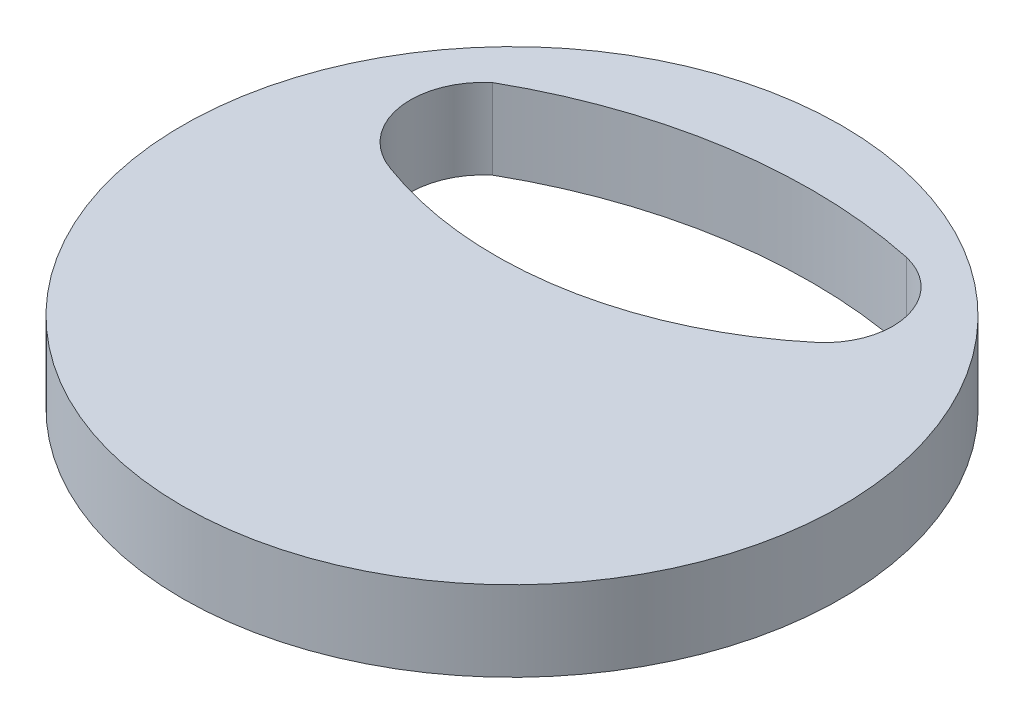
ISO-10303-21;
HEADER;
FILE_DESCRIPTION(('STEP AP214'),'2;1');
FILE_NAME('part.step','',(''),(''),'','','');
FILE_SCHEMA(('AUTOMOTIVE_DESIGN { 1 0 10303 214 1 1 1 1 }'));
ENDSEC;
DATA;
#1=APPLICATION_CONTEXT('core data for automotive mechanical design processes');
#2=APPLICATION_PROTOCOL_DEFINITION('international standard','automotive_design',2000,#1);
#3=PRODUCT_CONTEXT('',#1,'mechanical');
#4=PRODUCT('Part','Part','',(#3));
#5=PRODUCT_RELATED_PRODUCT_CATEGORY('part','',(#4));
#6=PRODUCT_DEFINITION_FORMATION('','',#4);
#7=PRODUCT_DEFINITION_CONTEXT('part definition',#1,'design');
#8=PRODUCT_DEFINITION('design','',#6,#7);
#9=PRODUCT_DEFINITION_SHAPE('','',#8);
#10=(LENGTH_UNIT() NAMED_UNIT(*) SI_UNIT(.MILLI.,.METRE.));
#11=(NAMED_UNIT(*) PLANE_ANGLE_UNIT() SI_UNIT($,.RADIAN.));
#12=(NAMED_UNIT(*) SI_UNIT($,.STERADIAN.) SOLID_ANGLE_UNIT());
#13=UNCERTAINTY_MEASURE_WITH_UNIT(LENGTH_MEASURE(1.E-05),#10,'distance_accuracy_value','');
#14=(GEOMETRIC_REPRESENTATION_CONTEXT(3) GLOBAL_UNCERTAINTY_ASSIGNED_CONTEXT((#13)) GLOBAL_UNIT_ASSIGNED_CONTEXT((#10,
#11,#12)) REPRESENTATION_CONTEXT('',''));
#15=CARTESIAN_POINT('',(0.,0.,0.));
#16=DIRECTION('',(0.,0.,1.));
#17=DIRECTION('',(1.,0.,0.));
#18=AXIS2_PLACEMENT_3D('',#15,#16,#17);
#19=CARTESIAN_POINT('',(0.,1.8,0.));
#20=DIRECTION('',(0.,-1.,0.));
#21=DIRECTION('',(0.,0.,-1.));
#22=AXIS2_PLACEMENT_3D('',#19,#20,#21);
#23=CYLINDRICAL_SURFACE('',#22,7.4);
#24=CARTESIAN_POINT('',(0.,1.8,0.));
#25=DIRECTION('',(0.,1.,0.));
#26=DIRECTION('',(0.,0.,1.));
#27=AXIS2_PLACEMENT_3D('',#24,#25,#26);
#28=CIRCLE('',#27,7.4);
#29=CARTESIAN_POINT('',(0.,1.8,7.4));
#30=VERTEX_POINT('',#29);
#31=EDGE_CURVE('E11',#30,#30,#28,.T.);
#32=ORIENTED_EDGE('',*,*,#31,.F.);
#33=EDGE_LOOP('',(#32));
#34=FACE_BOUND('',#33,.T.);
#35=CARTESIAN_POINT('',(0.,0.,0.));
#36=DIRECTION('',(0.,1.,0.));
#37=DIRECTION('',(0.,0.,1.));
#38=AXIS2_PLACEMENT_3D('',#35,#36,#37);
#39=CIRCLE('',#38,7.4);
#40=CARTESIAN_POINT('',(0.,0.,7.4));
#41=VERTEX_POINT('',#40);
#42=EDGE_CURVE('E39',#41,#41,#39,.T.);
#43=ORIENTED_EDGE('',*,*,#42,.T.);
#44=EDGE_LOOP('',(#43));
#45=FACE_BOUND('',#44,.T.);
#46=ADVANCED_FACE('F36',(#34,#45),#23,.T.);
#47=CARTESIAN_POINT('',(0.,1.8,0.));
#48=DIRECTION('',(0.,1.,0.));
#49=DIRECTION('',(0.,0.,1.));
#50=AXIS2_PLACEMENT_3D('',#47,#48,#49);
#51=PLANE('',#50);
#52=CARTESIAN_POINT('',(-3.69105713963817,1.8,-3.05644944928227));
#53=DIRECTION('',(0.,1.,0.));
#54=DIRECTION('',(0.,0.,1.));
#55=AXIS2_PLACEMENT_3D('',#52,#53,#54);
#56=CIRCLE('',#55,1.64727033061655);
#57=CARTESIAN_POINT('',(-4.75521293503789,1.8,-4.31385629881298));
#58=VERTEX_POINT('',#57);
#59=CARTESIAN_POINT('',(-4.22569992174715,1.8,-1.49835553758493));
#60=VERTEX_POINT('',#59);
#61=EDGE_CURVE('E50',#58,#60,#56,.T.);
#62=ORIENTED_EDGE('',*,*,#61,.F.);
#63=CARTESIAN_POINT('',(0.917943256878547,1.8,5.66676771895304));
#64=DIRECTION('',(0.,1.,0.));
#65=DIRECTION('',(0.,0.,1.));
#66=AXIS2_PLACEMENT_3D('',#63,#64,#65);
#67=CIRCLE('',#66,11.4803117101361);
#68=CARTESIAN_POINT('',(3.2882264842442,1.8,-5.56618889913985));
#69=VERTEX_POINT('',#68);
#70=EDGE_CURVE('E94',#58,#69,#67,.F.);
#71=ORIENTED_EDGE('',*,*,#70,.T.);
#72=CARTESIAN_POINT('',(2.945310918578,1.8,-4.07008865943443));
#73=DIRECTION('',(0.,1.,0.));
#74=DIRECTION('',(0.,0.,1.));
#75=AXIS2_PLACEMENT_3D('',#72,#73,#74);
#76=CIRCLE('',#75,1.53489641748972);
#77=CARTESIAN_POINT('',(3.9476634455724,1.8,-2.90767891065791));
#78=VERTEX_POINT('',#77);
#79=EDGE_CURVE('E97',#78,#69,#76,.T.);
#80=ORIENTED_EDGE('',*,*,#79,.F.);
#81=CARTESIAN_POINT('',(-1.35242436883095,1.8,-9.24015959200503));
#82=DIRECTION('',(0.,1.,0.));
#83=DIRECTION('',(0.,0.,1.));
#84=AXIS2_PLACEMENT_3D('',#81,#82,#83);
#85=CIRCLE('',#84,8.25779888469206);
#86=EDGE_CURVE('E103',#60,#78,#85,.T.);
#87=ORIENTED_EDGE('',*,*,#86,.F.);
#88=EDGE_LOOP('',(#62,#71,#80,#87));
#89=FACE_BOUND('',#88,.T.);
#90=ORIENTED_EDGE('',*,*,#31,.T.);
#91=EDGE_LOOP('',(#90));
#92=FACE_BOUND('',#91,.T.);
#93=ADVANCED_FACE('F114',(#89,#92),#51,.T.);
#94=CARTESIAN_POINT('',(0.,0.,0.));
#95=DIRECTION('',(0.,1.,0.));
#96=DIRECTION('',(0.,0.,1.));
#97=AXIS2_PLACEMENT_3D('',#94,#95,#96);
#98=PLANE('',#97);
#99=CARTESIAN_POINT('',(0.917943256878547,0.,5.66676771895304));
#100=DIRECTION('',(0.,1.,0.));
#101=DIRECTION('',(0.,0.,1.));
#102=AXIS2_PLACEMENT_3D('',#99,#100,#101);
#103=CIRCLE('',#102,11.4803117101361);
#104=CARTESIAN_POINT('',(-4.75521293503789,0.,-4.31385629881298));
#105=VERTEX_POINT('',#104);
#106=CARTESIAN_POINT('',(3.2882264842442,0.,-5.56618889913985));
#107=VERTEX_POINT('',#106);
#108=EDGE_CURVE('E85',#105,#107,#103,.F.);
#109=ORIENTED_EDGE('',*,*,#108,.F.);
#110=CARTESIAN_POINT('',(-3.69105713963817,0.,-3.05644944928227));
#111=DIRECTION('',(0.,1.,0.));
#112=DIRECTION('',(0.,0.,1.));
#113=AXIS2_PLACEMENT_3D('',#110,#111,#112);
#114=CIRCLE('',#113,1.64727033061655);
#115=CARTESIAN_POINT('',(-4.22569992174715,0.,-1.49835553758493));
#116=VERTEX_POINT('',#115);
#117=EDGE_CURVE('E79',#105,#116,#114,.T.);
#118=ORIENTED_EDGE('',*,*,#117,.T.);
#119=CARTESIAN_POINT('',(-1.35242436883095,0.,-9.24015959200503));
#120=DIRECTION('',(0.,1.,0.));
#121=DIRECTION('',(0.,0.,1.));
#122=AXIS2_PLACEMENT_3D('',#119,#120,#121);
#123=CIRCLE('',#122,8.25779888469206);
#124=CARTESIAN_POINT('',(3.9476634455724,0.,-2.90767891065791));
#125=VERTEX_POINT('',#124);
#126=EDGE_CURVE('E88',#116,#125,#123,.T.);
#127=ORIENTED_EDGE('',*,*,#126,.T.);
#128=CARTESIAN_POINT('',(2.945310918578,0.,-4.07008865943443));
#129=DIRECTION('',(0.,1.,0.));
#130=DIRECTION('',(0.,0.,1.));
#131=AXIS2_PLACEMENT_3D('',#128,#129,#130);
#132=CIRCLE('',#131,1.53489641748972);
#133=EDGE_CURVE('E58',#125,#107,#132,.T.);
#134=ORIENTED_EDGE('',*,*,#133,.T.);
#135=EDGE_LOOP('',(#109,#118,#127,#134));
#136=FACE_BOUND('',#135,.T.);
#137=ORIENTED_EDGE('',*,*,#42,.F.);
#138=EDGE_LOOP('',(#137));
#139=FACE_BOUND('',#138,.T.);
#140=ADVANCED_FACE('F92',(#136,#139),#98,.F.);
#141=CARTESIAN_POINT('',(-3.69105713963817,0.,-3.05644944928227));
#142=DIRECTION('',(0.,1.,0.));
#143=DIRECTION('',(0.,0.,1.));
#144=AXIS2_PLACEMENT_3D('',#141,#142,#143);
#145=CYLINDRICAL_SURFACE('',#144,1.64727033061655);
#146=ORIENTED_EDGE('',*,*,#61,.T.);
#147=DIRECTION('',(0.,1.,0.));
#148=VECTOR('',#147,1.);
#149=CARTESIAN_POINT('',(-4.22569992174715,0.,-1.49835553758493));
#150=LINE('',#149,#148);
#151=EDGE_CURVE('E75',#116,#60,#150,.T.);
#152=ORIENTED_EDGE('',*,*,#151,.F.);
#153=ORIENTED_EDGE('',*,*,#117,.F.);
#154=DIRECTION('',(0.,1.,0.));
#155=VECTOR('',#154,1.);
#156=CARTESIAN_POINT('',(-4.75521293503789,0.,-4.31385629881298));
#157=LINE('',#156,#155);
#158=EDGE_CURVE('E107',#105,#58,#157,.T.);
#159=ORIENTED_EDGE('',*,*,#158,.T.);
#160=EDGE_LOOP('',(#146,#152,#153,#159));
#161=FACE_BOUND('',#160,.T.);
#162=ADVANCED_FACE('F77',(#161),#145,.F.);
#163=CARTESIAN_POINT('',(0.917943256878547,0.,5.66676771895304));
#164=DIRECTION('',(0.,1.,0.));
#165=DIRECTION('',(0.,0.,1.));
#166=AXIS2_PLACEMENT_3D('',#163,#164,#165);
#167=CYLINDRICAL_SURFACE('',#166,11.4803117101361);
#168=ORIENTED_EDGE('',*,*,#70,.F.);
#169=ORIENTED_EDGE('',*,*,#158,.F.);
#170=ORIENTED_EDGE('',*,*,#108,.T.);
#171=DIRECTION('',(0.,1.,0.));
#172=VECTOR('',#171,1.);
#173=CARTESIAN_POINT('',(3.2882264842442,0.,-5.56618889913985));
#174=LINE('',#173,#172);
#175=EDGE_CURVE('E109',#107,#69,#174,.T.);
#176=ORIENTED_EDGE('',*,*,#175,.T.);
#177=EDGE_LOOP('',(#168,#169,#170,#176));
#178=FACE_BOUND('',#177,.T.);
#179=ADVANCED_FACE('F118',(#178),#167,.F.);
#180=CARTESIAN_POINT('',(2.945310918578,0.,-4.07008865943443));
#181=DIRECTION('',(0.,1.,0.));
#182=DIRECTION('',(0.,0.,1.));
#183=AXIS2_PLACEMENT_3D('',#180,#181,#182);
#184=CYLINDRICAL_SURFACE('',#183,1.53489641748972);
#185=ORIENTED_EDGE('',*,*,#79,.T.);
#186=ORIENTED_EDGE('',*,*,#175,.F.);
#187=ORIENTED_EDGE('',*,*,#133,.F.);
#188=DIRECTION('',(0.,1.,0.));
#189=VECTOR('',#188,1.);
#190=CARTESIAN_POINT('',(3.9476634455724,0.,-2.90767891065791));
#191=LINE('',#190,#189);
#192=EDGE_CURVE('E84',#125,#78,#191,.T.);
#193=ORIENTED_EDGE('',*,*,#192,.T.);
#194=EDGE_LOOP('',(#185,#186,#187,#193));
#195=FACE_BOUND('',#194,.T.);
#196=ADVANCED_FACE('F111',(#195),#184,.F.);
#197=CARTESIAN_POINT('',(-1.35242436883095,0.,-9.24015959200503));
#198=DIRECTION('',(0.,1.,0.));
#199=DIRECTION('',(0.,0.,1.));
#200=AXIS2_PLACEMENT_3D('',#197,#198,#199);
#201=CYLINDRICAL_SURFACE('',#200,8.25779888469206);
#202=ORIENTED_EDGE('',*,*,#86,.T.);
#203=ORIENTED_EDGE('',*,*,#192,.F.);
#204=ORIENTED_EDGE('',*,*,#126,.F.);
#205=ORIENTED_EDGE('',*,*,#151,.T.);
#206=EDGE_LOOP('',(#202,#203,#204,#205));
#207=FACE_BOUND('',#206,.T.);
#208=ADVANCED_FACE('F89',(#207),#201,.F.);
#209=CLOSED_SHELL('',(#46,#93,#140,#162,#179,#196,#208));
#210=MANIFOLD_SOLID_BREP('B2',#209);
#211=ADVANCED_BREP_SHAPE_REPRESENTATION('',(#18,#210),#14);
#212=SHAPE_DEFINITION_REPRESENTATION(#9,#211);
ENDSEC;
END-ISO-10303-21;
